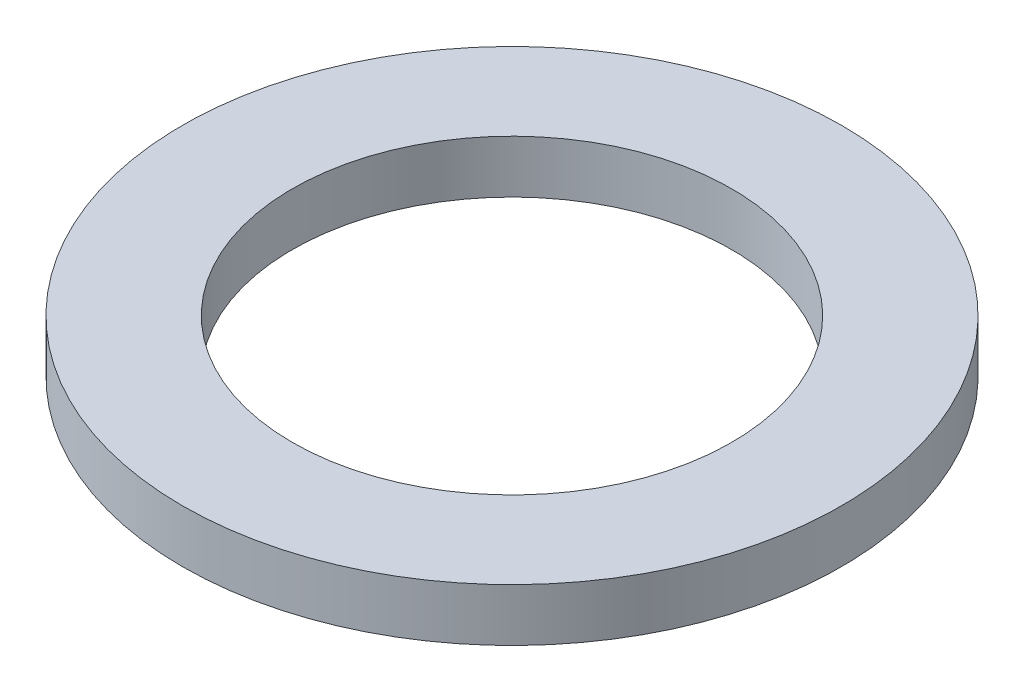
ISO-10303-21;
HEADER;
FILE_DESCRIPTION(('STEP AP214'),'2;1');
FILE_NAME('part.step','',(''),(''),'','','');
FILE_SCHEMA(('AUTOMOTIVE_DESIGN { 1 0 10303 214 1 1 1 1 }'));
ENDSEC;
DATA;
#1=APPLICATION_CONTEXT('core data for automotive mechanical design processes');
#2=APPLICATION_PROTOCOL_DEFINITION('international standard','automotive_design',2000,#1);
#3=PRODUCT_CONTEXT('',#1,'mechanical');
#4=PRODUCT('Part','Part','',(#3));
#5=PRODUCT_RELATED_PRODUCT_CATEGORY('part','',(#4));
#6=PRODUCT_DEFINITION_FORMATION('','',#4);
#7=PRODUCT_DEFINITION_CONTEXT('part definition',#1,'design');
#8=PRODUCT_DEFINITION('design','',#6,#7);
#9=PRODUCT_DEFINITION_SHAPE('','',#8);
#10=(LENGTH_UNIT() NAMED_UNIT(*) SI_UNIT(.MILLI.,.METRE.));
#11=(NAMED_UNIT(*) PLANE_ANGLE_UNIT() SI_UNIT($,.RADIAN.));
#12=(NAMED_UNIT(*) SI_UNIT($,.STERADIAN.) SOLID_ANGLE_UNIT());
#13=UNCERTAINTY_MEASURE_WITH_UNIT(LENGTH_MEASURE(1.E-05),#10,'distance_accuracy_value','');
#14=(GEOMETRIC_REPRESENTATION_CONTEXT(3) GLOBAL_UNCERTAINTY_ASSIGNED_CONTEXT((#13)) GLOBAL_UNIT_ASSIGNED_CONTEXT((#10,
#11,#12)) REPRESENTATION_CONTEXT('',''));
#15=CARTESIAN_POINT('',(0.,0.,0.));
#16=DIRECTION('',(0.,0.,1.));
#17=DIRECTION('',(1.,0.,0.));
#18=AXIS2_PLACEMENT_3D('',#15,#16,#17);
#19=CARTESIAN_POINT('',(0.,1.524,0.));
#20=DIRECTION('',(0.,-1.,0.));
#21=DIRECTION('',(0.,0.,-1.));
#22=AXIS2_PLACEMENT_3D('',#19,#20,#21);
#23=CYLINDRICAL_SURFACE('',#22,9.525);
#24=CARTESIAN_POINT('',(0.,1.524,0.));
#25=DIRECTION('',(0.,1.,0.));
#26=DIRECTION('',(0.,0.,1.));
#27=AXIS2_PLACEMENT_3D('',#24,#25,#26);
#28=CIRCLE('',#27,9.525);
#29=CARTESIAN_POINT('',(0.,1.524,-9.525));
#30=VERTEX_POINT('',#29);
#31=EDGE_CURVE('E10',#30,#30,#28,.T.);
#32=CARTESIAN_POINT('',(0.,0.,0.));
#33=DIRECTION('',(0.,1.,0.));
#34=DIRECTION('',(0.,0.,1.));
#35=AXIS2_PLACEMENT_3D('',#32,#33,#34);
#36=CIRCLE('',#35,9.525);
#37=CARTESIAN_POINT('',(0.,0.,-9.525));
#38=VERTEX_POINT('',#37);
#39=EDGE_CURVE('E33',#38,#38,#36,.T.);
#40=CARTESIAN_POINT('',(0.,1.524,-9.525));
#41=CARTESIAN_POINT('',(0.,1.508125,-9.525));
#42=CARTESIAN_POINT('',(0.,1.49225,-9.525));
#43=CARTESIAN_POINT('',(0.,1.4605,-9.525));
#44=CARTESIAN_POINT('',(0.,1.444625,-9.525));
#45=CARTESIAN_POINT('',(0.,1.412875,-9.525));
#46=CARTESIAN_POINT('',(0.,1.397,-9.525));
#47=CARTESIAN_POINT('',(0.,1.36525,-9.525));
#48=CARTESIAN_POINT('',(0.,1.349375,-9.525));
#49=CARTESIAN_POINT('',(0.,1.317625,-9.525));
#50=CARTESIAN_POINT('',(0.,1.30175,-9.525));
#51=CARTESIAN_POINT('',(0.,1.27,-9.525));
#52=CARTESIAN_POINT('',(0.,1.254125,-9.525));
#53=CARTESIAN_POINT('',(0.,1.222375,-9.525));
#54=CARTESIAN_POINT('',(0.,1.2065,-9.525));
#55=CARTESIAN_POINT('',(0.,1.17475,-9.525));
#56=CARTESIAN_POINT('',(0.,1.158875,-9.525));
#57=CARTESIAN_POINT('',(0.,1.127125,-9.525));
#58=CARTESIAN_POINT('',(0.,1.11125,-9.525));
#59=CARTESIAN_POINT('',(0.,1.0795,-9.525));
#60=CARTESIAN_POINT('',(0.,1.063625,-9.525));
#61=CARTESIAN_POINT('',(0.,1.031875,-9.525));
#62=CARTESIAN_POINT('',(0.,1.016,-9.525));
#63=CARTESIAN_POINT('',(0.,0.98425,-9.525));
#64=CARTESIAN_POINT('',(0.,0.968375,-9.525));
#65=CARTESIAN_POINT('',(0.,0.936625,-9.525));
#66=CARTESIAN_POINT('',(0.,0.92075,-9.525));
#67=CARTESIAN_POINT('',(0.,0.889,-9.525));
#68=CARTESIAN_POINT('',(0.,0.873125,-9.525));
#69=CARTESIAN_POINT('',(0.,0.841375,-9.525));
#70=CARTESIAN_POINT('',(0.,0.8255,-9.525));
#71=CARTESIAN_POINT('',(0.,0.79375,-9.525));
#72=CARTESIAN_POINT('',(0.,0.777875,-9.525));
#73=CARTESIAN_POINT('',(0.,0.746125,-9.525));
#74=CARTESIAN_POINT('',(0.,0.73025,-9.525));
#75=CARTESIAN_POINT('',(0.,0.6985,-9.525));
#76=CARTESIAN_POINT('',(0.,0.682625,-9.525));
#77=CARTESIAN_POINT('',(0.,0.650875,-9.525));
#78=CARTESIAN_POINT('',(0.,0.635,-9.525));
#79=CARTESIAN_POINT('',(0.,0.60325,-9.525));
#80=CARTESIAN_POINT('',(0.,0.587375,-9.525));
#81=CARTESIAN_POINT('',(0.,0.555625,-9.525));
#82=CARTESIAN_POINT('',(0.,0.53975,-9.525));
#83=CARTESIAN_POINT('',(0.,0.508,-9.525));
#84=CARTESIAN_POINT('',(0.,0.492125,-9.525));
#85=CARTESIAN_POINT('',(0.,0.460375,-9.525));
#86=CARTESIAN_POINT('',(0.,0.4445,-9.525));
#87=CARTESIAN_POINT('',(0.,0.41275,-9.525));
#88=CARTESIAN_POINT('',(0.,0.396875,-9.525));
#89=CARTESIAN_POINT('',(0.,0.365125,-9.525));
#90=CARTESIAN_POINT('',(0.,0.34925,-9.525));
#91=CARTESIAN_POINT('',(0.,0.3175,-9.525));
#92=CARTESIAN_POINT('',(0.,0.301625,-9.525));
#93=CARTESIAN_POINT('',(0.,0.269875,-9.525));
#94=CARTESIAN_POINT('',(0.,0.254,-9.525));
#95=CARTESIAN_POINT('',(0.,0.22225,-9.525));
#96=CARTESIAN_POINT('',(0.,0.206375,-9.525));
#97=CARTESIAN_POINT('',(0.,0.174625,-9.525));
#98=CARTESIAN_POINT('',(0.,0.15875,-9.525));
#99=CARTESIAN_POINT('',(0.,0.127,-9.525));
#100=CARTESIAN_POINT('',(0.,0.111125,-9.525));
#101=CARTESIAN_POINT('',(0.,0.079375,-9.525));
#102=CARTESIAN_POINT('',(0.,0.0635,-9.525));
#103=CARTESIAN_POINT('',(0.,0.0317499999999999,-9.525));
#104=CARTESIAN_POINT('',(0.,0.015875,-9.525));
#105=CARTESIAN_POINT('',(0.,0.,-9.525));
#106=B_SPLINE_CURVE_WITH_KNOTS('',3,(#40,#41,#42,#43,#44,#45,#46,#47,#48,#49,#50,#51,#52,#53,
#54,#55,#56,#57,#58,#59,#60,#61,#62,#63,#64,#65,#66,#67,#68,#69,#70,#71,#72,#73,#74,#75,#76,#77,
#78,#79,#80,#81,#82,#83,#84,#85,#86,#87,#88,#89,#90,#91,#92,#93,#94,#95,#96,#97,#98,#99,#100,
#101,#102,#103,#104,#105),.UNSPECIFIED.,.F.,.F.,(4,2,2,2,2,2,2,2,2,2,2,2,2,2,2,2,2,2,2,2,2,2,2,
2,2,2,2,2,2,2,2,2,4),(0.,0.0476250000000001,0.0952500000000001,0.142875,0.1905,0.238125,0.28575,
0.333375,0.381,0.428625,0.47625,0.523875,0.5715,0.619125,0.66675,0.714375,0.762,0.809625,
0.85725,0.904875,0.9525,1.000125,1.04775,1.095375,1.143,1.190625,1.23825,1.285875,1.3335,
1.381125,1.42875,1.476375,1.524),.UNSPECIFIED.);
#107=EDGE_CURVE('BSEAM30',#30,#38,#106,.T.);
#108=ORIENTED_EDGE('',*,*,#31,.F.);
#109=ORIENTED_EDGE('',*,*,#39,.T.);
#110=ORIENTED_EDGE('',*,*,#107,.T.);
#111=ORIENTED_EDGE('',*,*,#107,.F.);
#112=EDGE_LOOP('',(#108,#110,#109,#111));
#113=FACE_BOUND('',#112,.T.);
#114=ADVANCED_FACE('F30',(#113),#23,.T.);
#115=CARTESIAN_POINT('',(0.,1.524,0.));
#116=DIRECTION('',(0.,1.,0.));
#117=DIRECTION('',(0.,0.,1.));
#118=AXIS2_PLACEMENT_3D('',#115,#116,#117);
#119=PLANE('',#118);
#120=CARTESIAN_POINT('',(0.,1.524,0.));
#121=DIRECTION('',(0.,1.,0.));
#122=DIRECTION('',(0.,0.,1.));
#123=AXIS2_PLACEMENT_3D('',#120,#121,#122);
#124=CIRCLE('',#123,6.35);
#125=CARTESIAN_POINT('',(0.,1.524,6.35));
#126=VERTEX_POINT('',#125);
#127=EDGE_CURVE('E42',#126,#126,#124,.T.);
#128=ORIENTED_EDGE('',*,*,#127,.F.);
#129=EDGE_LOOP('',(#128));
#130=FACE_BOUND('',#129,.T.);
#131=ORIENTED_EDGE('',*,*,#31,.T.);
#132=EDGE_LOOP('',(#131));
#133=FACE_BOUND('',#132,.T.);
#134=ADVANCED_FACE('F57',(#130,#133),#119,.T.);
#135=CARTESIAN_POINT('',(0.,0.,0.));
#136=DIRECTION('',(0.,1.,0.));
#137=DIRECTION('',(0.,0.,1.));
#138=AXIS2_PLACEMENT_3D('',#135,#136,#137);
#139=PLANE('',#138);
#140=CARTESIAN_POINT('',(0.,0.,0.));
#141=DIRECTION('',(0.,1.,0.));
#142=DIRECTION('',(0.,0.,1.));
#143=AXIS2_PLACEMENT_3D('',#140,#141,#142);
#144=CIRCLE('',#143,6.35);
#145=CARTESIAN_POINT('',(0.,0.,6.35));
#146=VERTEX_POINT('',#145);
#147=EDGE_CURVE('E40',#146,#146,#144,.T.);
#148=ORIENTED_EDGE('',*,*,#147,.T.);
#149=EDGE_LOOP('',(#148));
#150=FACE_BOUND('',#149,.T.);
#151=ORIENTED_EDGE('',*,*,#39,.F.);
#152=EDGE_LOOP('',(#151));
#153=FACE_BOUND('',#152,.T.);
#154=ADVANCED_FACE('F48',(#150,#153),#139,.F.);
#155=CARTESIAN_POINT('',(0.,0.,0.));
#156=DIRECTION('',(0.,1.,0.));
#157=DIRECTION('',(0.,0.,1.));
#158=AXIS2_PLACEMENT_3D('',#155,#156,#157);
#159=CYLINDRICAL_SURFACE('',#158,6.35);
#160=CARTESIAN_POINT('',(0.,0.,6.35));
#161=CARTESIAN_POINT('',(0.,0.015875,6.35));
#162=CARTESIAN_POINT('',(0.,0.03175,6.35));
#163=CARTESIAN_POINT('',(0.,0.0635,6.35));
#164=CARTESIAN_POINT('',(0.,0.079375,6.35));
#165=CARTESIAN_POINT('',(0.,0.111125,6.35));
#166=CARTESIAN_POINT('',(0.,0.127,6.35));
#167=CARTESIAN_POINT('',(0.,0.15875,6.35));
#168=CARTESIAN_POINT('',(0.,0.174625,6.35));
#169=CARTESIAN_POINT('',(0.,0.206375,6.35));
#170=CARTESIAN_POINT('',(0.,0.22225,6.35));
#171=CARTESIAN_POINT('',(0.,0.254,6.35));
#172=CARTESIAN_POINT('',(0.,0.269875,6.35));
#173=CARTESIAN_POINT('',(0.,0.301625,6.35));
#174=CARTESIAN_POINT('',(0.,0.3175,6.35));
#175=CARTESIAN_POINT('',(0.,0.34925,6.35));
#176=CARTESIAN_POINT('',(0.,0.365125,6.35));
#177=CARTESIAN_POINT('',(0.,0.396875,6.35));
#178=CARTESIAN_POINT('',(0.,0.41275,6.35));
#179=CARTESIAN_POINT('',(0.,0.4445,6.35));
#180=CARTESIAN_POINT('',(0.,0.460375,6.35));
#181=CARTESIAN_POINT('',(0.,0.492125,6.35));
#182=CARTESIAN_POINT('',(0.,0.508,6.35));
#183=CARTESIAN_POINT('',(0.,0.53975,6.35));
#184=CARTESIAN_POINT('',(0.,0.555625,6.35));
#185=CARTESIAN_POINT('',(0.,0.587375,6.35));
#186=CARTESIAN_POINT('',(0.,0.60325,6.35));
#187=CARTESIAN_POINT('',(0.,0.635,6.35));
#188=CARTESIAN_POINT('',(0.,0.650875,6.35));
#189=CARTESIAN_POINT('',(0.,0.682625,6.35));
#190=CARTESIAN_POINT('',(0.,0.6985,6.35));
#191=CARTESIAN_POINT('',(0.,0.73025,6.35));
#192=CARTESIAN_POINT('',(0.,0.746125,6.35));
#193=CARTESIAN_POINT('',(0.,0.777875,6.35));
#194=CARTESIAN_POINT('',(0.,0.79375,6.35));
#195=CARTESIAN_POINT('',(0.,0.8255,6.35));
#196=CARTESIAN_POINT('',(0.,0.841375,6.35));
#197=CARTESIAN_POINT('',(0.,0.873125,6.35));
#198=CARTESIAN_POINT('',(0.,0.889,6.35));
#199=CARTESIAN_POINT('',(0.,0.92075,6.35));
#200=CARTESIAN_POINT('',(0.,0.936625,6.35));
#201=CARTESIAN_POINT('',(0.,0.968375,6.35));
#202=CARTESIAN_POINT('',(0.,0.98425,6.35));
#203=CARTESIAN_POINT('',(0.,1.016,6.35));
#204=CARTESIAN_POINT('',(0.,1.031875,6.35));
#205=CARTESIAN_POINT('',(0.,1.063625,6.35));
#206=CARTESIAN_POINT('',(0.,1.0795,6.35));
#207=CARTESIAN_POINT('',(0.,1.11125,6.35));
#208=CARTESIAN_POINT('',(0.,1.127125,6.35));
#209=CARTESIAN_POINT('',(0.,1.158875,6.35));
#210=CARTESIAN_POINT('',(0.,1.17475,6.35));
#211=CARTESIAN_POINT('',(0.,1.2065,6.35));
#212=CARTESIAN_POINT('',(0.,1.222375,6.35));
#213=CARTESIAN_POINT('',(0.,1.254125,6.35));
#214=CARTESIAN_POINT('',(0.,1.27,6.35));
#215=CARTESIAN_POINT('',(0.,1.30175,6.35));
#216=CARTESIAN_POINT('',(0.,1.317625,6.35));
#217=CARTESIAN_POINT('',(0.,1.349375,6.35));
#218=CARTESIAN_POINT('',(0.,1.36525,6.35));
#219=CARTESIAN_POINT('',(0.,1.397,6.35));
#220=CARTESIAN_POINT('',(0.,1.412875,6.35));
#221=CARTESIAN_POINT('',(0.,1.444625,6.35));
#222=CARTESIAN_POINT('',(0.,1.4605,6.35));
#223=CARTESIAN_POINT('',(0.,1.49225,6.35));
#224=CARTESIAN_POINT('',(0.,1.508125,6.35));
#225=CARTESIAN_POINT('',(0.,1.524,6.35));
#226=B_SPLINE_CURVE_WITH_KNOTS('',3,(#160,#161,#162,#163,#164,#165,#166,#167,#168,#169,#170,
#171,#172,#173,#174,#175,#176,#177,#178,#179,#180,#181,#182,#183,#184,#185,#186,#187,#188,#189,
#190,#191,#192,#193,#194,#195,#196,#197,#198,#199,#200,#201,#202,#203,#204,#205,#206,#207,#208,
#209,#210,#211,#212,#213,#214,#215,#216,#217,#218,#219,#220,#221,#222,#223,#224,#225),
.UNSPECIFIED.,.F.,.F.,(4,2,2,2,2,2,2,2,2,2,2,2,2,2,2,2,2,2,2,2,2,2,2,2,2,2,2,2,2,2,2,2,4),(0.,
0.047625,0.09525,0.142875,0.1905,0.238125,0.28575,0.333375,0.381,0.428625,0.47625,0.523875,
0.5715,0.619125,0.66675,0.714375,0.762,0.809625,0.85725,0.904875,0.9525,1.000125,1.04775,
1.095375,1.143,1.190625,1.23825,1.285875,1.3335,1.381125,1.42875,1.476375,1.524),.UNSPECIFIED.);
#227=EDGE_CURVE('BSEAM51',#146,#126,#226,.T.);
#228=ORIENTED_EDGE('',*,*,#147,.F.);
#229=ORIENTED_EDGE('',*,*,#127,.T.);
#230=ORIENTED_EDGE('',*,*,#227,.T.);
#231=ORIENTED_EDGE('',*,*,#227,.F.);
#232=EDGE_LOOP('',(#228,#230,#229,#231));
#233=FACE_BOUND('',#232,.T.);
#234=ADVANCED_FACE('F51',(#233),#159,.F.);
#235=CLOSED_SHELL('',(#114,#134,#154,#234));
#236=MANIFOLD_SOLID_BREP('B2',#235);
#237=ADVANCED_BREP_SHAPE_REPRESENTATION('',(#18,#236),#14);
#238=SHAPE_DEFINITION_REPRESENTATION(#9,#237);
ENDSEC;
END-ISO-10303-21;
